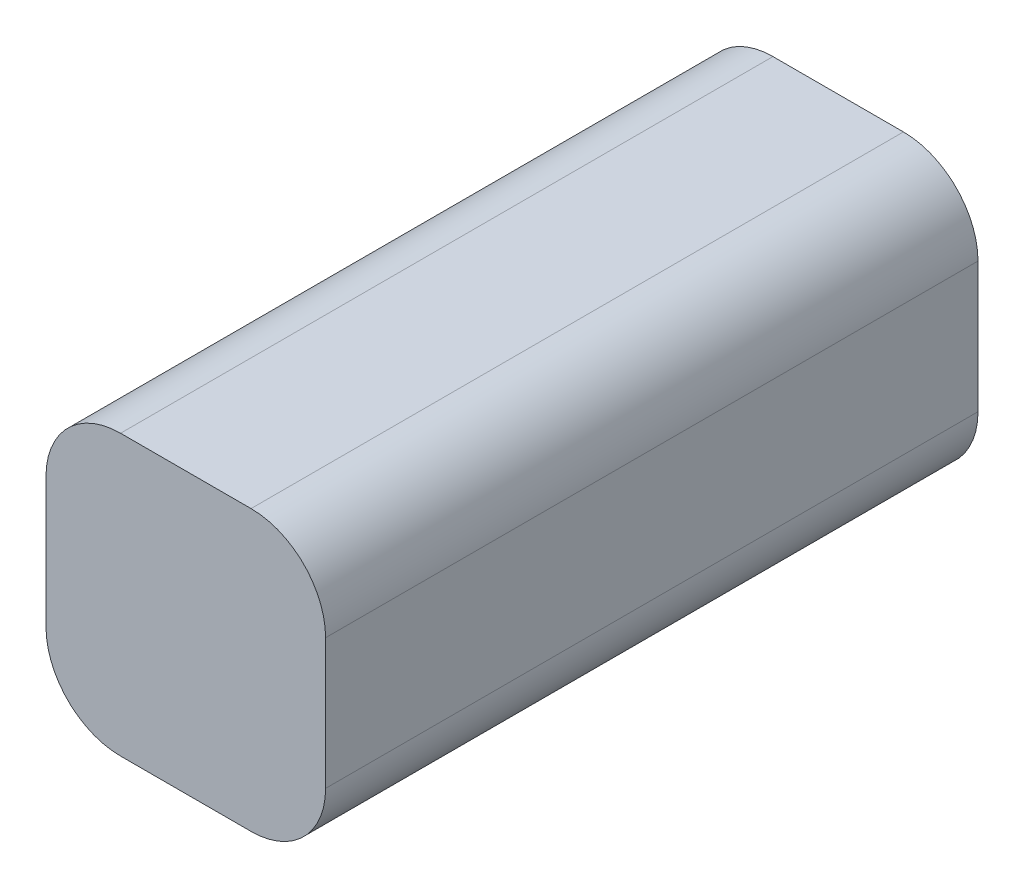
ISO-10303-21;
HEADER;
FILE_DESCRIPTION(('STEP AP214'),'2;1');
FILE_NAME('part.step','',(''),(''),'','','');
FILE_SCHEMA(('AUTOMOTIVE_DESIGN { 1 0 10303 214 1 1 1 1 }'));
ENDSEC;
DATA;
#1=APPLICATION_CONTEXT('core data for automotive mechanical design processes');
#2=APPLICATION_PROTOCOL_DEFINITION('international standard','automotive_design',2000,#1);
#3=PRODUCT_CONTEXT('',#1,'mechanical');
#4=PRODUCT('Part','Part','',(#3));
#5=PRODUCT_RELATED_PRODUCT_CATEGORY('part','',(#4));
#6=PRODUCT_DEFINITION_FORMATION('','',#4);
#7=PRODUCT_DEFINITION_CONTEXT('part definition',#1,'design');
#8=PRODUCT_DEFINITION('design','',#6,#7);
#9=PRODUCT_DEFINITION_SHAPE('','',#8);
#10=(LENGTH_UNIT() NAMED_UNIT(*) SI_UNIT(.MILLI.,.METRE.));
#11=(NAMED_UNIT(*) PLANE_ANGLE_UNIT() SI_UNIT($,.RADIAN.));
#12=(NAMED_UNIT(*) SI_UNIT($,.STERADIAN.) SOLID_ANGLE_UNIT());
#13=UNCERTAINTY_MEASURE_WITH_UNIT(LENGTH_MEASURE(1.E-05),#10,'distance_accuracy_value','');
#14=(GEOMETRIC_REPRESENTATION_CONTEXT(3) GLOBAL_UNCERTAINTY_ASSIGNED_CONTEXT((#13)) GLOBAL_UNIT_ASSIGNED_CONTEXT((#10,
#11,#12)) REPRESENTATION_CONTEXT('',''));
#15=CARTESIAN_POINT('',(0.,0.,0.));
#16=DIRECTION('',(0.,0.,1.));
#17=DIRECTION('',(1.,0.,0.));
#18=AXIS2_PLACEMENT_3D('',#15,#16,#17);
#19=CARTESIAN_POINT('',(-190.5,-190.5,889.));
#20=DIRECTION('',(1.,0.,0.));
#21=DIRECTION('',(0.,0.,-1.));
#22=AXIS2_PLACEMENT_3D('',#19,#20,#21);
#23=PLANE('',#22);
#24=DIRECTION('',(0.,-1.,0.));
#25=VECTOR('',#24,1.);
#26=CARTESIAN_POINT('',(-190.5,-190.5,0.));
#27=LINE('',#26,#25);
#28=CARTESIAN_POINT('',(-190.5,88.9,0.));
#29=VERTEX_POINT('',#28);
#30=CARTESIAN_POINT('',(-190.5,-88.9,0.));
#31=VERTEX_POINT('',#30);
#32=EDGE_CURVE('E187',#29,#31,#27,.T.);
#33=ORIENTED_EDGE('',*,*,#32,.T.);
#34=DIRECTION('',(0.,0.,-1.));
#35=VECTOR('',#34,1.);
#36=CARTESIAN_POINT('',(-190.5,-88.9,889.));
#37=LINE('',#36,#35);
#38=CARTESIAN_POINT('',(-190.5,-88.9,889.));
#39=VERTEX_POINT('',#38);
#40=EDGE_CURVE('E11',#31,#39,#37,.F.);
#41=ORIENTED_EDGE('',*,*,#40,.T.);
#42=DIRECTION('',(0.,-1.,0.));
#43=VECTOR('',#42,1.);
#44=CARTESIAN_POINT('',(-190.5,-190.5,889.));
#45=LINE('',#44,#43);
#46=CARTESIAN_POINT('',(-190.5,88.9,889.));
#47=VERTEX_POINT('',#46);
#48=EDGE_CURVE('E140',#47,#39,#45,.T.);
#49=ORIENTED_EDGE('',*,*,#48,.F.);
#50=DIRECTION('',(0.,0.,-1.));
#51=VECTOR('',#50,1.);
#52=CARTESIAN_POINT('',(-190.5,88.9,889.));
#53=LINE('',#52,#51);
#54=EDGE_CURVE('E53',#47,#29,#53,.T.);
#55=ORIENTED_EDGE('',*,*,#54,.T.);
#56=EDGE_LOOP('',(#33,#41,#49,#55));
#57=FACE_BOUND('',#56,.T.);
#58=ADVANCED_FACE('F44',(#57),#23,.F.);
#59=CARTESIAN_POINT('',(190.5,-190.5,889.));
#60=DIRECTION('',(0.,1.,0.));
#61=DIRECTION('',(-1.,0.,0.));
#62=AXIS2_PLACEMENT_3D('',#59,#60,#61);
#63=PLANE('',#62);
#64=DIRECTION('',(1.,0.,0.));
#65=VECTOR('',#64,1.);
#66=CARTESIAN_POINT('',(190.5,-190.5,0.));
#67=LINE('',#66,#65);
#68=CARTESIAN_POINT('',(-88.9,-190.5,0.));
#69=VERTEX_POINT('',#68);
#70=CARTESIAN_POINT('',(88.9,-190.5,0.));
#71=VERTEX_POINT('',#70);
#72=EDGE_CURVE('E147',#69,#71,#67,.T.);
#73=ORIENTED_EDGE('',*,*,#72,.T.);
#74=DIRECTION('',(0.,0.,-1.));
#75=VECTOR('',#74,1.);
#76=CARTESIAN_POINT('',(88.9,-190.5,889.));
#77=LINE('',#76,#75);
#78=CARTESIAN_POINT('',(88.9,-190.5,889.));
#79=VERTEX_POINT('',#78);
#80=EDGE_CURVE('E60',#71,#79,#77,.F.);
#81=ORIENTED_EDGE('',*,*,#80,.T.);
#82=DIRECTION('',(1.,0.,0.));
#83=VECTOR('',#82,1.);
#84=CARTESIAN_POINT('',(190.5,-190.5,889.));
#85=LINE('',#84,#83);
#86=CARTESIAN_POINT('',(-88.9,-190.5,889.));
#87=VERTEX_POINT('',#86);
#88=EDGE_CURVE('E145',#87,#79,#85,.T.);
#89=ORIENTED_EDGE('',*,*,#88,.F.);
#90=DIRECTION('',(0.,0.,-1.));
#91=VECTOR('',#90,1.);
#92=CARTESIAN_POINT('',(-88.9,-190.5,889.));
#93=LINE('',#92,#91);
#94=EDGE_CURVE('E176',#87,#69,#93,.T.);
#95=ORIENTED_EDGE('',*,*,#94,.T.);
#96=EDGE_LOOP('',(#73,#81,#89,#95));
#97=FACE_BOUND('',#96,.T.);
#98=ADVANCED_FACE('F212',(#97),#63,.F.);
#99=CARTESIAN_POINT('',(190.5,-190.5,889.));
#100=DIRECTION('',(-1.,0.,0.));
#101=DIRECTION('',(0.,0.,1.));
#102=AXIS2_PLACEMENT_3D('',#99,#100,#101);
#103=PLANE('',#102);
#104=DIRECTION('',(0.,1.,0.));
#105=VECTOR('',#104,1.);
#106=CARTESIAN_POINT('',(190.5,-190.5,0.));
#107=LINE('',#106,#105);
#108=CARTESIAN_POINT('',(190.5,-88.9,0.));
#109=VERTEX_POINT('',#108);
#110=CARTESIAN_POINT('',(190.5,88.9,0.));
#111=VERTEX_POINT('',#110);
#112=EDGE_CURVE('E141',#109,#111,#107,.T.);
#113=ORIENTED_EDGE('',*,*,#112,.T.);
#114=DIRECTION('',(0.,0.,-1.));
#115=VECTOR('',#114,1.);
#116=CARTESIAN_POINT('',(190.5,88.9,889.));
#117=LINE('',#116,#115);
#118=CARTESIAN_POINT('',(190.5,88.9,889.));
#119=VERTEX_POINT('',#118);
#120=EDGE_CURVE('E116',#111,#119,#117,.F.);
#121=ORIENTED_EDGE('',*,*,#120,.T.);
#122=DIRECTION('',(0.,1.,0.));
#123=VECTOR('',#122,1.);
#124=CARTESIAN_POINT('',(190.5,-190.5,889.));
#125=LINE('',#124,#123);
#126=CARTESIAN_POINT('',(190.5,-88.9,889.));
#127=VERTEX_POINT('',#126);
#128=EDGE_CURVE('E198',#127,#119,#125,.T.);
#129=ORIENTED_EDGE('',*,*,#128,.F.);
#130=DIRECTION('',(0.,0.,-1.));
#131=VECTOR('',#130,1.);
#132=CARTESIAN_POINT('',(190.5,-88.9,889.));
#133=LINE('',#132,#131);
#134=EDGE_CURVE('E122',#127,#109,#133,.T.);
#135=ORIENTED_EDGE('',*,*,#134,.T.);
#136=EDGE_LOOP('',(#113,#121,#129,#135));
#137=FACE_BOUND('',#136,.T.);
#138=ADVANCED_FACE('F211',(#137),#103,.F.);
#139=CARTESIAN_POINT('',(190.5,190.5,889.));
#140=DIRECTION('',(0.,-1.,0.));
#141=DIRECTION('',(1.,0.,0.));
#142=AXIS2_PLACEMENT_3D('',#139,#140,#141);
#143=PLANE('',#142);
#144=DIRECTION('',(-1.,0.,0.));
#145=VECTOR('',#144,1.);
#146=CARTESIAN_POINT('',(190.5,190.5,889.));
#147=LINE('',#146,#145);
#148=CARTESIAN_POINT('',(88.9,190.5,889.));
#149=VERTEX_POINT('',#148);
#150=CARTESIAN_POINT('',(-88.9,190.5,889.));
#151=VERTEX_POINT('',#150);
#152=EDGE_CURVE('E132',#149,#151,#147,.T.);
#153=ORIENTED_EDGE('',*,*,#152,.F.);
#154=DIRECTION('',(0.,0.,-1.));
#155=VECTOR('',#154,1.);
#156=CARTESIAN_POINT('',(88.9,190.5,889.));
#157=LINE('',#156,#155);
#158=CARTESIAN_POINT('',(88.9,190.5,0.));
#159=VERTEX_POINT('',#158);
#160=EDGE_CURVE('E115',#149,#159,#157,.T.);
#161=ORIENTED_EDGE('',*,*,#160,.T.);
#162=DIRECTION('',(-1.,0.,0.));
#163=VECTOR('',#162,1.);
#164=CARTESIAN_POINT('',(190.5,190.5,0.));
#165=LINE('',#164,#163);
#166=CARTESIAN_POINT('',(-88.9,190.5,0.));
#167=VERTEX_POINT('',#166);
#168=EDGE_CURVE('E129',#159,#167,#165,.T.);
#169=ORIENTED_EDGE('',*,*,#168,.T.);
#170=DIRECTION('',(0.,0.,-1.));
#171=VECTOR('',#170,1.);
#172=CARTESIAN_POINT('',(-88.9,190.5,889.));
#173=LINE('',#172,#171);
#174=EDGE_CURVE('E135',#167,#151,#173,.F.);
#175=ORIENTED_EDGE('',*,*,#174,.T.);
#176=EDGE_LOOP('',(#153,#161,#169,#175));
#177=FACE_BOUND('',#176,.T.);
#178=ADVANCED_FACE('F128',(#177),#143,.F.);
#179=CARTESIAN_POINT('',(0.,0.,889.));
#180=DIRECTION('',(0.,0.,1.));
#181=DIRECTION('',(1.,0.,0.));
#182=AXIS2_PLACEMENT_3D('',#179,#180,#181);
#183=PLANE('',#182);
#184=ORIENTED_EDGE('',*,*,#128,.T.);
#185=CARTESIAN_POINT('',(88.9,88.9,889.));
#186=DIRECTION('',(0.,0.,1.));
#187=DIRECTION('',(1.,0.,0.));
#188=AXIS2_PLACEMENT_3D('',#185,#186,#187);
#189=CIRCLE('',#188,101.6);
#190=EDGE_CURVE('E173',#119,#149,#189,.T.);
#191=ORIENTED_EDGE('',*,*,#190,.T.);
#192=ORIENTED_EDGE('',*,*,#152,.T.);
#193=CARTESIAN_POINT('',(-88.9,88.9,889.));
#194=DIRECTION('',(0.,0.,1.));
#195=DIRECTION('',(1.,0.,0.));
#196=AXIS2_PLACEMENT_3D('',#193,#194,#195);
#197=CIRCLE('',#196,101.6);
#198=EDGE_CURVE('E165',#151,#47,#197,.T.);
#199=ORIENTED_EDGE('',*,*,#198,.T.);
#200=ORIENTED_EDGE('',*,*,#48,.T.);
#201=CARTESIAN_POINT('',(-88.9,-88.9,889.));
#202=DIRECTION('',(0.,0.,1.));
#203=DIRECTION('',(1.,0.,0.));
#204=AXIS2_PLACEMENT_3D('',#201,#202,#203);
#205=CIRCLE('',#204,101.6);
#206=EDGE_CURVE('E67',#39,#87,#205,.T.);
#207=ORIENTED_EDGE('',*,*,#206,.T.);
#208=ORIENTED_EDGE('',*,*,#88,.T.);
#209=CARTESIAN_POINT('',(88.9,-88.9,889.));
#210=DIRECTION('',(0.,0.,1.));
#211=DIRECTION('',(1.,0.,0.));
#212=AXIS2_PLACEMENT_3D('',#209,#210,#211);
#213=CIRCLE('',#212,101.6);
#214=EDGE_CURVE('E170',#79,#127,#213,.T.);
#215=ORIENTED_EDGE('',*,*,#214,.T.);
#216=EDGE_LOOP('',(#184,#191,#192,#199,#200,#207,#208,#215));
#217=FACE_BOUND('',#216,.T.);
#218=ADVANCED_FACE('F204',(#217),#183,.T.);
#219=CARTESIAN_POINT('',(0.,0.,0.));
#220=DIRECTION('',(0.,0.,1.));
#221=DIRECTION('',(1.,0.,0.));
#222=AXIS2_PLACEMENT_3D('',#219,#220,#221);
#223=PLANE('',#222);
#224=ORIENTED_EDGE('',*,*,#168,.F.);
#225=CARTESIAN_POINT('',(88.9,88.9,0.));
#226=DIRECTION('',(0.,0.,1.));
#227=DIRECTION('',(1.,0.,0.));
#228=AXIS2_PLACEMENT_3D('',#225,#226,#227);
#229=CIRCLE('',#228,101.6);
#230=EDGE_CURVE('E111',#159,#111,#229,.F.);
#231=ORIENTED_EDGE('',*,*,#230,.T.);
#232=ORIENTED_EDGE('',*,*,#112,.F.);
#233=CARTESIAN_POINT('',(88.9,-88.9,0.));
#234=DIRECTION('',(0.,0.,1.));
#235=DIRECTION('',(1.,0.,0.));
#236=AXIS2_PLACEMENT_3D('',#233,#234,#235);
#237=CIRCLE('',#236,101.6);
#238=EDGE_CURVE('E123',#109,#71,#237,.F.);
#239=ORIENTED_EDGE('',*,*,#238,.T.);
#240=ORIENTED_EDGE('',*,*,#72,.F.);
#241=CARTESIAN_POINT('',(-88.9,-88.9,0.));
#242=DIRECTION('',(0.,0.,1.));
#243=DIRECTION('',(1.,0.,0.));
#244=AXIS2_PLACEMENT_3D('',#241,#242,#243);
#245=CIRCLE('',#244,101.6);
#246=EDGE_CURVE('E155',#69,#31,#245,.F.);
#247=ORIENTED_EDGE('',*,*,#246,.T.);
#248=ORIENTED_EDGE('',*,*,#32,.F.);
#249=CARTESIAN_POINT('',(-88.9,88.9,0.));
#250=DIRECTION('',(0.,0.,1.));
#251=DIRECTION('',(1.,0.,0.));
#252=AXIS2_PLACEMENT_3D('',#249,#250,#251);
#253=CIRCLE('',#252,101.6);
#254=EDGE_CURVE('E134',#29,#167,#253,.F.);
#255=ORIENTED_EDGE('',*,*,#254,.T.);
#256=EDGE_LOOP('',(#224,#231,#232,#239,#240,#247,#248,#255));
#257=FACE_BOUND('',#256,.T.);
#258=ADVANCED_FACE('F137',(#257),#223,.F.);
#259=CARTESIAN_POINT('',(88.9,88.9,889.));
#260=DIRECTION('',(0.,0.,-1.));
#261=DIRECTION('',(-1.,0.,0.));
#262=AXIS2_PLACEMENT_3D('',#259,#260,#261);
#263=CYLINDRICAL_SURFACE('',#262,101.6);
#264=ORIENTED_EDGE('',*,*,#190,.F.);
#265=ORIENTED_EDGE('',*,*,#120,.F.);
#266=ORIENTED_EDGE('',*,*,#230,.F.);
#267=ORIENTED_EDGE('',*,*,#160,.F.);
#268=EDGE_LOOP('',(#264,#265,#266,#267));
#269=FACE_BOUND('',#268,.T.);
#270=ADVANCED_FACE('F114',(#269),#263,.T.);
#271=CARTESIAN_POINT('',(88.9,-88.9,889.));
#272=DIRECTION('',(0.,0.,-1.));
#273=DIRECTION('',(-1.,0.,0.));
#274=AXIS2_PLACEMENT_3D('',#271,#272,#273);
#275=CYLINDRICAL_SURFACE('',#274,101.6);
#276=ORIENTED_EDGE('',*,*,#214,.F.);
#277=ORIENTED_EDGE('',*,*,#80,.F.);
#278=ORIENTED_EDGE('',*,*,#238,.F.);
#279=ORIENTED_EDGE('',*,*,#134,.F.);
#280=EDGE_LOOP('',(#276,#277,#278,#279));
#281=FACE_BOUND('',#280,.T.);
#282=ADVANCED_FACE('F209',(#281),#275,.T.);
#283=CARTESIAN_POINT('',(-88.9,-88.9,889.));
#284=DIRECTION('',(0.,0.,-1.));
#285=DIRECTION('',(-1.,0.,0.));
#286=AXIS2_PLACEMENT_3D('',#283,#284,#285);
#287=CYLINDRICAL_SURFACE('',#286,101.6);
#288=ORIENTED_EDGE('',*,*,#206,.F.);
#289=ORIENTED_EDGE('',*,*,#40,.F.);
#290=ORIENTED_EDGE('',*,*,#246,.F.);
#291=ORIENTED_EDGE('',*,*,#94,.F.);
#292=EDGE_LOOP('',(#288,#289,#290,#291));
#293=FACE_BOUND('',#292,.T.);
#294=ADVANCED_FACE('F214',(#293),#287,.T.);
#295=CARTESIAN_POINT('',(-88.9,88.9,889.));
#296=DIRECTION('',(0.,0.,-1.));
#297=DIRECTION('',(-1.,0.,0.));
#298=AXIS2_PLACEMENT_3D('',#295,#296,#297);
#299=CYLINDRICAL_SURFACE('',#298,101.6);
#300=ORIENTED_EDGE('',*,*,#198,.F.);
#301=ORIENTED_EDGE('',*,*,#174,.F.);
#302=ORIENTED_EDGE('',*,*,#254,.F.);
#303=ORIENTED_EDGE('',*,*,#54,.F.);
#304=EDGE_LOOP('',(#300,#301,#302,#303));
#305=FACE_BOUND('',#304,.T.);
#306=ADVANCED_FACE('F46',(#305),#299,.T.);
#307=CLOSED_SHELL('',(#58,#98,#138,#178,#218,#258,#270,#282,#294,#306));
#308=MANIFOLD_SOLID_BREP('B2',#307);
#309=ADVANCED_BREP_SHAPE_REPRESENTATION('',(#18,#308),#14);
#310=SHAPE_DEFINITION_REPRESENTATION(#9,#309);
ENDSEC;
END-ISO-10303-21;
